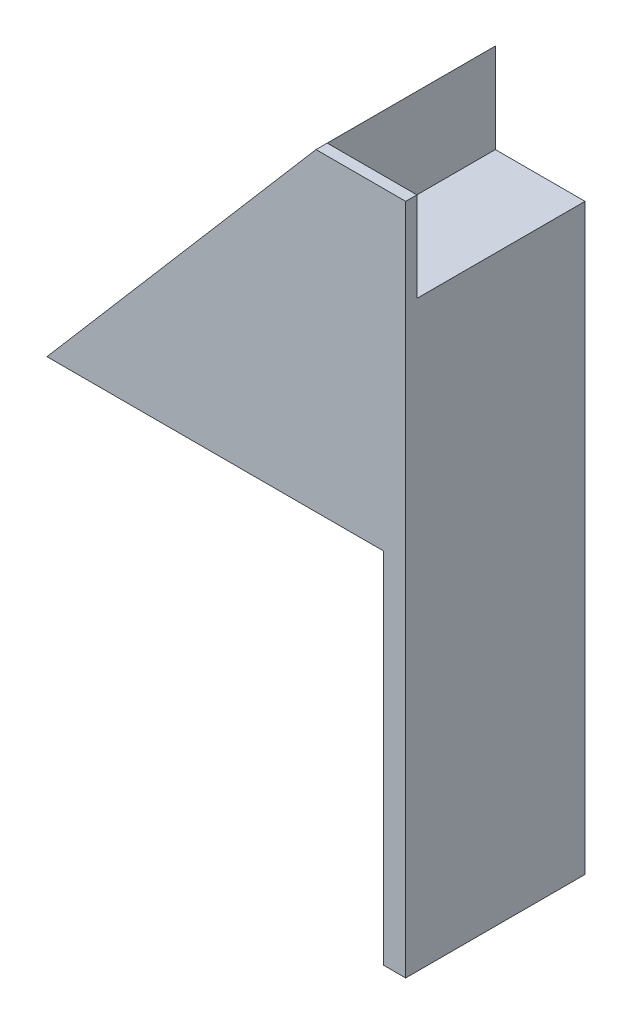
ISO-10303-21;
HEADER;
FILE_DESCRIPTION(('STEP AP214'),'2;1');
FILE_NAME('part.step','',(''),(''),'','','');
FILE_SCHEMA(('AUTOMOTIVE_DESIGN { 1 0 10303 214 1 1 1 1 }'));
ENDSEC;
DATA;
#1=APPLICATION_CONTEXT('core data for automotive mechanical design processes');
#2=APPLICATION_PROTOCOL_DEFINITION('international standard','automotive_design',2000,#1);
#3=PRODUCT_CONTEXT('',#1,'mechanical');
#4=PRODUCT('Part','Part','',(#3));
#5=PRODUCT_RELATED_PRODUCT_CATEGORY('part','',(#4));
#6=PRODUCT_DEFINITION_FORMATION('','',#4);
#7=PRODUCT_DEFINITION_CONTEXT('part definition',#1,'design');
#8=PRODUCT_DEFINITION('design','',#6,#7);
#9=PRODUCT_DEFINITION_SHAPE('','',#8);
#10=(LENGTH_UNIT() NAMED_UNIT(*) SI_UNIT(.MILLI.,.METRE.));
#11=(NAMED_UNIT(*) PLANE_ANGLE_UNIT() SI_UNIT($,.RADIAN.));
#12=(NAMED_UNIT(*) SI_UNIT($,.STERADIAN.) SOLID_ANGLE_UNIT());
#13=UNCERTAINTY_MEASURE_WITH_UNIT(LENGTH_MEASURE(1.E-05),#10,'distance_accuracy_value','');
#14=(GEOMETRIC_REPRESENTATION_CONTEXT(3) GLOBAL_UNCERTAINTY_ASSIGNED_CONTEXT((#13)) GLOBAL_UNIT_ASSIGNED_CONTEXT((#10,
#11,#12)) REPRESENTATION_CONTEXT('',''));
#15=CARTESIAN_POINT('',(0.,0.,0.));
#16=DIRECTION('',(0.,0.,1.));
#17=DIRECTION('',(1.,0.,0.));
#18=AXIS2_PLACEMENT_3D('',#15,#16,#17);
#19=CARTESIAN_POINT('',(9.525,44.45,12.7));
#20=DIRECTION('',(0.,-1.,0.));
#21=DIRECTION('',(0.,0.,-1.));
#22=AXIS2_PLACEMENT_3D('',#19,#20,#21);
#23=PLANE('',#22);
#24=DIRECTION('',(1.,0.,0.));
#25=VECTOR('',#24,1.);
#26=CARTESIAN_POINT('',(22.225,44.45,11.1125));
#27=LINE('',#26,#25);
#28=CARTESIAN_POINT('',(9.525,44.45,11.1125));
#29=VERTEX_POINT('',#28);
#30=CARTESIAN_POINT('',(22.225,44.45,11.1125));
#31=VERTEX_POINT('',#30);
#32=EDGE_CURVE('E151',#29,#31,#27,.T.);
#33=ORIENTED_EDGE('',*,*,#32,.F.);
#34=DIRECTION('',(0.,0.,-1.));
#35=VECTOR('',#34,1.);
#36=CARTESIAN_POINT('',(9.525,44.45,12.7));
#37=LINE('',#36,#35);
#38=CARTESIAN_POINT('',(9.525,44.45,12.7));
#39=VERTEX_POINT('',#38);
#40=EDGE_CURVE('E41',#39,#29,#37,.T.);
#41=ORIENTED_EDGE('',*,*,#40,.F.);
#42=DIRECTION('',(-1.,0.,0.));
#43=VECTOR('',#42,1.);
#44=CARTESIAN_POINT('',(9.525,44.45,12.7));
#45=LINE('',#44,#43);
#46=CARTESIAN_POINT('',(22.225,44.45,12.7));
#47=VERTEX_POINT('',#46);
#48=EDGE_CURVE('E149',#47,#39,#45,.T.);
#49=ORIENTED_EDGE('',*,*,#48,.F.);
#50=DIRECTION('',(0.,0.,-1.));
#51=VECTOR('',#50,1.);
#52=CARTESIAN_POINT('',(22.225,44.45,12.7));
#53=LINE('',#52,#51);
#54=EDGE_CURVE('E11',#47,#31,#53,.T.);
#55=ORIENTED_EDGE('',*,*,#54,.T.);
#56=EDGE_LOOP('',(#33,#41,#49,#55));
#57=FACE_BOUND('',#56,.T.);
#58=ADVANCED_FACE('F33',(#57),#23,.F.);
#59=CARTESIAN_POINT('',(22.225,31.75,12.7));
#60=DIRECTION('',(-1.,0.,0.));
#61=DIRECTION('',(0.,0.,1.));
#62=AXIS2_PLACEMENT_3D('',#59,#60,#61);
#63=PLANE('',#62);
#64=DIRECTION('',(0.,1.,0.));
#65=VECTOR('',#64,1.);
#66=CARTESIAN_POINT('',(22.225,31.75,-12.7));
#67=LINE('',#66,#65);
#68=CARTESIAN_POINT('',(22.225,-50.8,-12.7));
#69=VERTEX_POINT('',#68);
#70=CARTESIAN_POINT('',(22.225,31.75,-12.7));
#71=VERTEX_POINT('',#70);
#72=EDGE_CURVE('E78',#69,#71,#67,.T.);
#73=ORIENTED_EDGE('',*,*,#72,.T.);
#74=DIRECTION('',(0.,0.,-1.));
#75=VECTOR('',#74,1.);
#76=CARTESIAN_POINT('',(22.225,31.75,11.1125));
#77=LINE('',#76,#75);
#78=CARTESIAN_POINT('',(22.225,31.75,11.1125));
#79=VERTEX_POINT('',#78);
#80=EDGE_CURVE('E48',#79,#71,#77,.T.);
#81=ORIENTED_EDGE('',*,*,#80,.F.);
#82=DIRECTION('',(0.,-1.,0.));
#83=VECTOR('',#82,1.);
#84=CARTESIAN_POINT('',(22.225,44.45,11.1125));
#85=LINE('',#84,#83);
#86=EDGE_CURVE('E169',#31,#79,#85,.T.);
#87=ORIENTED_EDGE('',*,*,#86,.F.);
#88=ORIENTED_EDGE('',*,*,#54,.F.);
#89=DIRECTION('',(0.,1.,0.));
#90=VECTOR('',#89,1.);
#91=CARTESIAN_POINT('',(22.225,31.75,12.7));
#92=LINE('',#91,#90);
#93=CARTESIAN_POINT('',(22.225,-50.8,12.7));
#94=VERTEX_POINT('',#93);
#95=EDGE_CURVE('E84',#94,#47,#92,.T.);
#96=ORIENTED_EDGE('',*,*,#95,.F.);
#97=DIRECTION('',(0.,0.,-1.));
#98=VECTOR('',#97,1.);
#99=CARTESIAN_POINT('',(22.225,-50.8,12.7));
#100=LINE('',#99,#98);
#101=EDGE_CURVE('E120',#94,#69,#100,.T.);
#102=ORIENTED_EDGE('',*,*,#101,.T.);
#103=EDGE_LOOP('',(#73,#81,#87,#88,#96,#102));
#104=FACE_BOUND('',#103,.T.);
#105=ADVANCED_FACE('F35',(#104),#63,.F.);
#106=CARTESIAN_POINT('',(-28.575,0.,12.7));
#107=DIRECTION('',(0.759256602365296,-0.650791373455968,0.));
#108=DIRECTION('',(0.650791373455969,0.759256602365297,0.));
#109=AXIS2_PLACEMENT_3D('',#106,#107,#108);
#110=PLANE('',#109);
#111=DIRECTION('',(-0.650791373455968,-0.759256602365297,0.));
#112=VECTOR('',#111,1.);
#113=CARTESIAN_POINT('',(-28.575,0.,-12.7));
#114=LINE('',#113,#112);
#115=CARTESIAN_POINT('',(9.525,44.45,-12.7));
#116=VERTEX_POINT('',#115);
#117=CARTESIAN_POINT('',(-28.575,0.,-12.7));
#118=VERTEX_POINT('',#117);
#119=EDGE_CURVE('E125',#116,#118,#114,.T.);
#120=ORIENTED_EDGE('',*,*,#119,.T.);
#121=DIRECTION('',(0.,0.,-1.));
#122=VECTOR('',#121,1.);
#123=CARTESIAN_POINT('',(-28.575,0.,12.7));
#124=LINE('',#123,#122);
#125=CARTESIAN_POINT('',(-28.575,0.,12.7));
#126=VERTEX_POINT('',#125);
#127=EDGE_CURVE('E114',#126,#118,#124,.T.);
#128=ORIENTED_EDGE('',*,*,#127,.F.);
#129=DIRECTION('',(-0.650791373455968,-0.759256602365297,0.));
#130=VECTOR('',#129,1.);
#131=CARTESIAN_POINT('',(-28.575,0.,12.7));
#132=LINE('',#131,#130);
#133=EDGE_CURVE('E102',#39,#126,#132,.T.);
#134=ORIENTED_EDGE('',*,*,#133,.F.);
#135=ORIENTED_EDGE('',*,*,#40,.T.);
#136=DIRECTION('',(0.,0.,-1.));
#137=VECTOR('',#136,1.);
#138=CARTESIAN_POINT('',(9.525,44.45,11.1125));
#139=LINE('',#138,#137);
#140=EDGE_CURVE('E126',#29,#116,#139,.T.);
#141=ORIENTED_EDGE('',*,*,#140,.T.);
#142=EDGE_LOOP('',(#120,#128,#134,#135,#141));
#143=FACE_BOUND('',#142,.T.);
#144=ADVANCED_FACE('F141',(#143),#110,.F.);
#145=CARTESIAN_POINT('',(19.05,0.,12.7));
#146=DIRECTION('',(0.,1.,0.));
#147=DIRECTION('',(-1.,0.,0.));
#148=AXIS2_PLACEMENT_3D('',#145,#146,#147);
#149=PLANE('',#148);
#150=DIRECTION('',(1.,0.,0.));
#151=VECTOR('',#150,1.);
#152=CARTESIAN_POINT('',(19.05,0.,-12.7));
#153=LINE('',#152,#151);
#154=CARTESIAN_POINT('',(19.05,0.,-12.7));
#155=VERTEX_POINT('',#154);
#156=EDGE_CURVE('E111',#118,#155,#153,.T.);
#157=ORIENTED_EDGE('',*,*,#156,.T.);
#158=DIRECTION('',(0.,0.,-1.));
#159=VECTOR('',#158,1.);
#160=CARTESIAN_POINT('',(19.05,0.,12.7));
#161=LINE('',#160,#159);
#162=CARTESIAN_POINT('',(19.05,0.,12.7));
#163=VERTEX_POINT('',#162);
#164=EDGE_CURVE('E108',#163,#155,#161,.T.);
#165=ORIENTED_EDGE('',*,*,#164,.F.);
#166=DIRECTION('',(1.,0.,0.));
#167=VECTOR('',#166,1.);
#168=CARTESIAN_POINT('',(19.05,0.,12.7));
#169=LINE('',#168,#167);
#170=EDGE_CURVE('E95',#126,#163,#169,.T.);
#171=ORIENTED_EDGE('',*,*,#170,.F.);
#172=ORIENTED_EDGE('',*,*,#127,.T.);
#173=EDGE_LOOP('',(#157,#165,#171,#172));
#174=FACE_BOUND('',#173,.T.);
#175=ADVANCED_FACE('F109',(#174),#149,.F.);
#176=CARTESIAN_POINT('',(19.05,-50.8,12.7));
#177=DIRECTION('',(1.,0.,0.));
#178=DIRECTION('',(0.,0.,-1.));
#179=AXIS2_PLACEMENT_3D('',#176,#177,#178);
#180=PLANE('',#179);
#181=DIRECTION('',(0.,-1.,0.));
#182=VECTOR('',#181,1.);
#183=CARTESIAN_POINT('',(19.05,-50.8,-12.7));
#184=LINE('',#183,#182);
#185=CARTESIAN_POINT('',(19.05,-50.8,-12.7));
#186=VERTEX_POINT('',#185);
#187=EDGE_CURVE('E129',#155,#186,#184,.T.);
#188=ORIENTED_EDGE('',*,*,#187,.T.);
#189=DIRECTION('',(0.,0.,-1.));
#190=VECTOR('',#189,1.);
#191=CARTESIAN_POINT('',(19.05,-50.8,12.7));
#192=LINE('',#191,#190);
#193=CARTESIAN_POINT('',(19.05,-50.8,12.7));
#194=VERTEX_POINT('',#193);
#195=EDGE_CURVE('E115',#194,#186,#192,.T.);
#196=ORIENTED_EDGE('',*,*,#195,.F.);
#197=DIRECTION('',(0.,-1.,0.));
#198=VECTOR('',#197,1.);
#199=CARTESIAN_POINT('',(19.05,-50.8,12.7));
#200=LINE('',#199,#198);
#201=EDGE_CURVE('E99',#163,#194,#200,.T.);
#202=ORIENTED_EDGE('',*,*,#201,.F.);
#203=ORIENTED_EDGE('',*,*,#164,.T.);
#204=EDGE_LOOP('',(#188,#196,#202,#203));
#205=FACE_BOUND('',#204,.T.);
#206=ADVANCED_FACE('F117',(#205),#180,.F.);
#207=CARTESIAN_POINT('',(19.05,-50.8,12.7));
#208=DIRECTION('',(0.,1.,0.));
#209=DIRECTION('',(0.,0.,1.));
#210=AXIS2_PLACEMENT_3D('',#207,#208,#209);
#211=PLANE('',#210);
#212=DIRECTION('',(1.,0.,0.));
#213=VECTOR('',#212,1.);
#214=CARTESIAN_POINT('',(19.05,-50.8,-12.7));
#215=LINE('',#214,#213);
#216=EDGE_CURVE('E131',#186,#69,#215,.T.);
#217=ORIENTED_EDGE('',*,*,#216,.T.);
#218=ORIENTED_EDGE('',*,*,#101,.F.);
#219=DIRECTION('',(1.,0.,0.));
#220=VECTOR('',#219,1.);
#221=CARTESIAN_POINT('',(19.05,-50.8,12.7));
#222=LINE('',#221,#220);
#223=EDGE_CURVE('E57',#194,#94,#222,.T.);
#224=ORIENTED_EDGE('',*,*,#223,.F.);
#225=ORIENTED_EDGE('',*,*,#195,.T.);
#226=EDGE_LOOP('',(#217,#218,#224,#225));
#227=FACE_BOUND('',#226,.T.);
#228=ADVANCED_FACE('F191',(#227),#211,.F.);
#229=CARTESIAN_POINT('',(0.,0.,12.7));
#230=DIRECTION('',(0.,0.,1.));
#231=DIRECTION('',(1.,0.,0.));
#232=AXIS2_PLACEMENT_3D('',#229,#230,#231);
#233=PLANE('',#232);
#234=ORIENTED_EDGE('',*,*,#95,.T.);
#235=ORIENTED_EDGE('',*,*,#48,.T.);
#236=ORIENTED_EDGE('',*,*,#133,.T.);
#237=ORIENTED_EDGE('',*,*,#170,.T.);
#238=ORIENTED_EDGE('',*,*,#201,.T.);
#239=ORIENTED_EDGE('',*,*,#223,.T.);
#240=EDGE_LOOP('',(#234,#235,#236,#237,#238,#239));
#241=FACE_BOUND('',#240,.T.);
#242=ADVANCED_FACE('F97',(#241),#233,.T.);
#243=CARTESIAN_POINT('',(0.,0.,-12.7));
#244=DIRECTION('',(0.,0.,1.));
#245=DIRECTION('',(1.,0.,0.));
#246=AXIS2_PLACEMENT_3D('',#243,#244,#245);
#247=PLANE('',#246);
#248=ORIENTED_EDGE('',*,*,#119,.F.);
#249=DIRECTION('',(0.,1.,0.));
#250=VECTOR('',#249,1.);
#251=CARTESIAN_POINT('',(9.525,44.45,-12.7));
#252=LINE('',#251,#250);
#253=CARTESIAN_POINT('',(9.525,31.75,-12.7));
#254=VERTEX_POINT('',#253);
#255=EDGE_CURVE('E166',#254,#116,#252,.T.);
#256=ORIENTED_EDGE('',*,*,#255,.F.);
#257=DIRECTION('',(-1.,0.,0.));
#258=VECTOR('',#257,1.);
#259=CARTESIAN_POINT('',(22.225,31.75,-12.7));
#260=LINE('',#259,#258);
#261=EDGE_CURVE('E164',#71,#254,#260,.T.);
#262=ORIENTED_EDGE('',*,*,#261,.F.);
#263=ORIENTED_EDGE('',*,*,#72,.F.);
#264=ORIENTED_EDGE('',*,*,#216,.F.);
#265=ORIENTED_EDGE('',*,*,#187,.F.);
#266=ORIENTED_EDGE('',*,*,#156,.F.);
#267=EDGE_LOOP('',(#248,#256,#262,#263,#264,#265,#266));
#268=FACE_BOUND('',#267,.T.);
#269=ADVANCED_FACE('F182',(#268),#247,.F.);
#270=CARTESIAN_POINT('',(9.525,44.45,11.1125));
#271=DIRECTION('',(-1.,0.,0.));
#272=DIRECTION('',(0.,0.,1.));
#273=AXIS2_PLACEMENT_3D('',#270,#271,#272);
#274=PLANE('',#273);
#275=ORIENTED_EDGE('',*,*,#255,.T.);
#276=ORIENTED_EDGE('',*,*,#140,.F.);
#277=DIRECTION('',(0.,1.,0.));
#278=VECTOR('',#277,1.);
#279=CARTESIAN_POINT('',(9.525,44.45,11.1125));
#280=LINE('',#279,#278);
#281=CARTESIAN_POINT('',(9.525,31.75,11.1125));
#282=VERTEX_POINT('',#281);
#283=EDGE_CURVE('E156',#282,#29,#280,.T.);
#284=ORIENTED_EDGE('',*,*,#283,.F.);
#285=DIRECTION('',(0.,0.,-1.));
#286=VECTOR('',#285,1.);
#287=CARTESIAN_POINT('',(9.525,31.75,11.1125));
#288=LINE('',#287,#286);
#289=EDGE_CURVE('E158',#282,#254,#288,.T.);
#290=ORIENTED_EDGE('',*,*,#289,.T.);
#291=EDGE_LOOP('',(#275,#276,#284,#290));
#292=FACE_BOUND('',#291,.T.);
#293=ADVANCED_FACE('F178',(#292),#274,.F.);
#294=CARTESIAN_POINT('',(22.225,31.75,11.1125));
#295=DIRECTION('',(0.,-1.,0.));
#296=DIRECTION('',(0.,0.,-1.));
#297=AXIS2_PLACEMENT_3D('',#294,#295,#296);
#298=PLANE('',#297);
#299=ORIENTED_EDGE('',*,*,#261,.T.);
#300=ORIENTED_EDGE('',*,*,#289,.F.);
#301=DIRECTION('',(-1.,0.,0.));
#302=VECTOR('',#301,1.);
#303=CARTESIAN_POINT('',(22.225,31.75,11.1125));
#304=LINE('',#303,#302);
#305=EDGE_CURVE('E160',#79,#282,#304,.T.);
#306=ORIENTED_EDGE('',*,*,#305,.F.);
#307=ORIENTED_EDGE('',*,*,#80,.T.);
#308=EDGE_LOOP('',(#299,#300,#306,#307));
#309=FACE_BOUND('',#308,.T.);
#310=ADVANCED_FACE('F181',(#309),#298,.F.);
#311=CARTESIAN_POINT('',(0.,0.,11.1125));
#312=DIRECTION('',(0.,0.,-1.));
#313=DIRECTION('',(-1.,0.,0.));
#314=AXIS2_PLACEMENT_3D('',#311,#312,#313);
#315=PLANE('',#314);
#316=ORIENTED_EDGE('',*,*,#86,.T.);
#317=ORIENTED_EDGE('',*,*,#305,.T.);
#318=ORIENTED_EDGE('',*,*,#283,.T.);
#319=ORIENTED_EDGE('',*,*,#32,.T.);
#320=EDGE_LOOP('',(#316,#317,#318,#319));
#321=FACE_BOUND('',#320,.T.);
#322=ADVANCED_FACE('F187',(#321),#315,.T.);
#323=CLOSED_SHELL('',(#58,#105,#144,#175,#206,#228,#242,#269,#293,#310,#322));
#324=MANIFOLD_SOLID_BREP('B2',#323);
#325=ADVANCED_BREP_SHAPE_REPRESENTATION('',(#18,#324),#14);
#326=SHAPE_DEFINITION_REPRESENTATION(#9,#325);
ENDSEC;
END-ISO-10303-21;
